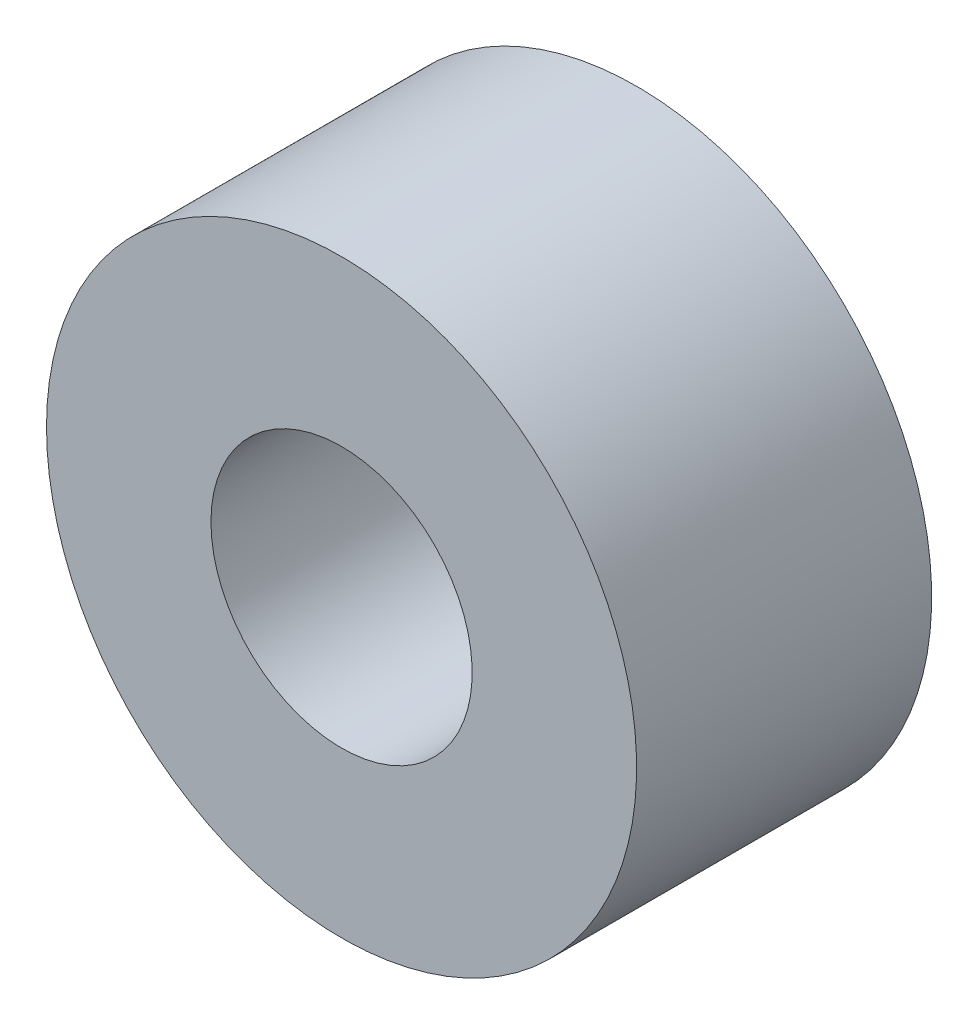
ISO-10303-21;
HEADER;
FILE_DESCRIPTION(('STEP AP214'),'2;1');
FILE_NAME('part.step','',(''),(''),'','','');
FILE_SCHEMA(('AUTOMOTIVE_DESIGN { 1 0 10303 214 1 1 1 1 }'));
ENDSEC;
DATA;
#1=APPLICATION_CONTEXT('core data for automotive mechanical design processes');
#2=APPLICATION_PROTOCOL_DEFINITION('international standard','automotive_design',2000,#1);
#3=PRODUCT_CONTEXT('',#1,'mechanical');
#4=PRODUCT('Part','Part','',(#3));
#5=PRODUCT_RELATED_PRODUCT_CATEGORY('part','',(#4));
#6=PRODUCT_DEFINITION_FORMATION('','',#4);
#7=PRODUCT_DEFINITION_CONTEXT('part definition',#1,'design');
#8=PRODUCT_DEFINITION('design','',#6,#7);
#9=PRODUCT_DEFINITION_SHAPE('','',#8);
#10=(LENGTH_UNIT() NAMED_UNIT(*) SI_UNIT(.MILLI.,.METRE.));
#11=(NAMED_UNIT(*) PLANE_ANGLE_UNIT() SI_UNIT($,.RADIAN.));
#12=(NAMED_UNIT(*) SI_UNIT($,.STERADIAN.) SOLID_ANGLE_UNIT());
#13=UNCERTAINTY_MEASURE_WITH_UNIT(LENGTH_MEASURE(1.E-05),#10,'distance_accuracy_value','');
#14=(GEOMETRIC_REPRESENTATION_CONTEXT(3) GLOBAL_UNCERTAINTY_ASSIGNED_CONTEXT((#13)) GLOBAL_UNIT_ASSIGNED_CONTEXT((#10,
#11,#12)) REPRESENTATION_CONTEXT('',''));
#15=CARTESIAN_POINT('',(0.,0.,0.));
#16=DIRECTION('',(0.,0.,1.));
#17=DIRECTION('',(1.,0.,0.));
#18=AXIS2_PLACEMENT_3D('',#15,#16,#17);
#19=CARTESIAN_POINT('',(0.,0.,2.38125));
#20=DIRECTION('',(0.,0.,1.));
#21=DIRECTION('',(1.,0.,0.));
#22=AXIS2_PLACEMENT_3D('',#19,#20,#21);
#23=PLANE('',#22);
#24=CARTESIAN_POINT('',(0.,0.,2.38125));
#25=DIRECTION('',(0.,0.,1.));
#26=DIRECTION('',(1.,0.,0.));
#27=AXIS2_PLACEMENT_3D('',#24,#25,#26);
#28=CIRCLE('',#27,4.7625);
#29=CARTESIAN_POINT('',(-4.7625,0.,2.38125));
#30=VERTEX_POINT('',#29);
#31=EDGE_CURVE('E10',#30,#30,#28,.T.);
#32=ORIENTED_EDGE('',*,*,#31,.T.);
#33=EDGE_LOOP('',(#32));
#34=FACE_BOUND('',#33,.T.);
#35=CARTESIAN_POINT('',(0.,0.,2.38125));
#36=DIRECTION('',(0.,0.,1.));
#37=DIRECTION('',(1.,0.,0.));
#38=AXIS2_PLACEMENT_3D('',#35,#36,#37);
#39=CIRCLE('',#38,2.1082);
#40=CARTESIAN_POINT('',(-2.1082,0.,2.38125));
#41=VERTEX_POINT('',#40);
#42=EDGE_CURVE('E41',#41,#41,#39,.T.);
#43=ORIENTED_EDGE('',*,*,#42,.F.);
#44=EDGE_LOOP('',(#43));
#45=FACE_BOUND('',#44,.T.);
#46=ADVANCED_FACE('F30',(#34,#45),#23,.T.);
#47=CARTESIAN_POINT('',(0.,0.,-2.38125));
#48=DIRECTION('',(0.,0.,1.));
#49=DIRECTION('',(1.,0.,0.));
#50=AXIS2_PLACEMENT_3D('',#47,#48,#49);
#51=PLANE('',#50);
#52=CARTESIAN_POINT('',(0.,0.,-2.38125));
#53=DIRECTION('',(0.,0.,1.));
#54=DIRECTION('',(1.,0.,0.));
#55=AXIS2_PLACEMENT_3D('',#52,#53,#54);
#56=CIRCLE('',#55,4.7625);
#57=CARTESIAN_POINT('',(-4.7625,0.,-2.38125));
#58=VERTEX_POINT('',#57);
#59=EDGE_CURVE('E34',#58,#58,#56,.T.);
#60=ORIENTED_EDGE('',*,*,#59,.F.);
#61=EDGE_LOOP('',(#60));
#62=FACE_BOUND('',#61,.T.);
#63=CARTESIAN_POINT('',(0.,0.,-2.38125));
#64=DIRECTION('',(0.,0.,1.));
#65=DIRECTION('',(1.,0.,0.));
#66=AXIS2_PLACEMENT_3D('',#63,#64,#65);
#67=CIRCLE('',#66,2.1082);
#68=CARTESIAN_POINT('',(-2.1082,0.,-2.38125));
#69=VERTEX_POINT('',#68);
#70=EDGE_CURVE('E43',#69,#69,#67,.T.);
#71=ORIENTED_EDGE('',*,*,#70,.T.);
#72=EDGE_LOOP('',(#71));
#73=FACE_BOUND('',#72,.T.);
#74=ADVANCED_FACE('F53',(#62,#73),#51,.F.);
#75=CARTESIAN_POINT('',(0.,0.,2.38125));
#76=DIRECTION('',(0.,0.,-1.));
#77=DIRECTION('',(-1.,0.,0.));
#78=AXIS2_PLACEMENT_3D('',#75,#76,#77);
#79=CYLINDRICAL_SURFACE('',#78,4.7625);
#80=CARTESIAN_POINT('',(-4.7625,0.,2.38125));
#81=CARTESIAN_POINT('',(-4.7625,0.,2.331640625));
#82=CARTESIAN_POINT('',(-4.7625,0.,2.28203125));
#83=CARTESIAN_POINT('',(-4.7625,0.,2.1828125));
#84=CARTESIAN_POINT('',(-4.7625,0.,2.133203125));
#85=CARTESIAN_POINT('',(-4.7625,0.,2.033984375));
#86=CARTESIAN_POINT('',(-4.7625,0.,1.984375));
#87=CARTESIAN_POINT('',(-4.7625,0.,1.88515625));
#88=CARTESIAN_POINT('',(-4.7625,0.,1.835546875));
#89=CARTESIAN_POINT('',(-4.7625,0.,1.736328125));
#90=CARTESIAN_POINT('',(-4.7625,0.,1.68671875));
#91=CARTESIAN_POINT('',(-4.7625,0.,1.5875));
#92=CARTESIAN_POINT('',(-4.7625,0.,1.537890625));
#93=CARTESIAN_POINT('',(-4.7625,0.,1.438671875));
#94=CARTESIAN_POINT('',(-4.7625,0.,1.3890625));
#95=CARTESIAN_POINT('',(-4.7625,0.,1.28984375));
#96=CARTESIAN_POINT('',(-4.7625,0.,1.240234375));
#97=CARTESIAN_POINT('',(-4.7625,0.,1.141015625));
#98=CARTESIAN_POINT('',(-4.7625,0.,1.09140625));
#99=CARTESIAN_POINT('',(-4.7625,0.,0.9921875));
#100=CARTESIAN_POINT('',(-4.7625,0.,0.942578125));
#101=CARTESIAN_POINT('',(-4.7625,0.,0.843359375));
#102=CARTESIAN_POINT('',(-4.7625,0.,0.79375));
#103=CARTESIAN_POINT('',(-4.7625,0.,0.69453125));
#104=CARTESIAN_POINT('',(-4.7625,0.,0.644921875));
#105=CARTESIAN_POINT('',(-4.7625,0.,0.545703125));
#106=CARTESIAN_POINT('',(-4.7625,0.,0.49609375));
#107=CARTESIAN_POINT('',(-4.7625,0.,0.396875));
#108=CARTESIAN_POINT('',(-4.7625,0.,0.347265625));
#109=CARTESIAN_POINT('',(-4.7625,0.,0.248046875));
#110=CARTESIAN_POINT('',(-4.7625,0.,0.1984375));
#111=CARTESIAN_POINT('',(-4.7625,0.,0.09921875));
#112=CARTESIAN_POINT('',(-4.7625,0.,0.049609375));
#113=CARTESIAN_POINT('',(-4.7625,0.,-0.049609375));
#114=CARTESIAN_POINT('',(-4.7625,0.,-0.09921875));
#115=CARTESIAN_POINT('',(-4.7625,0.,-0.1984375));
#116=CARTESIAN_POINT('',(-4.7625,0.,-0.248046875));
#117=CARTESIAN_POINT('',(-4.7625,0.,-0.347265625));
#118=CARTESIAN_POINT('',(-4.7625,0.,-0.396875));
#119=CARTESIAN_POINT('',(-4.7625,0.,-0.49609375));
#120=CARTESIAN_POINT('',(-4.7625,0.,-0.545703125));
#121=CARTESIAN_POINT('',(-4.7625,0.,-0.644921875));
#122=CARTESIAN_POINT('',(-4.7625,0.,-0.69453125));
#123=CARTESIAN_POINT('',(-4.7625,0.,-0.79375));
#124=CARTESIAN_POINT('',(-4.7625,0.,-0.843359375));
#125=CARTESIAN_POINT('',(-4.7625,0.,-0.942578125));
#126=CARTESIAN_POINT('',(-4.7625,0.,-0.9921875));
#127=CARTESIAN_POINT('',(-4.7625,0.,-1.09140625));
#128=CARTESIAN_POINT('',(-4.7625,0.,-1.141015625));
#129=CARTESIAN_POINT('',(-4.7625,0.,-1.240234375));
#130=CARTESIAN_POINT('',(-4.7625,0.,-1.28984375));
#131=CARTESIAN_POINT('',(-4.7625,0.,-1.3890625));
#132=CARTESIAN_POINT('',(-4.7625,0.,-1.438671875));
#133=CARTESIAN_POINT('',(-4.7625,0.,-1.537890625));
#134=CARTESIAN_POINT('',(-4.7625,0.,-1.5875));
#135=CARTESIAN_POINT('',(-4.7625,0.,-1.68671875));
#136=CARTESIAN_POINT('',(-4.7625,0.,-1.736328125));
#137=CARTESIAN_POINT('',(-4.7625,0.,-1.835546875));
#138=CARTESIAN_POINT('',(-4.7625,0.,-1.88515625));
#139=CARTESIAN_POINT('',(-4.7625,0.,-1.984375));
#140=CARTESIAN_POINT('',(-4.7625,0.,-2.033984375));
#141=CARTESIAN_POINT('',(-4.7625,0.,-2.133203125));
#142=CARTESIAN_POINT('',(-4.7625,0.,-2.1828125));
#143=CARTESIAN_POINT('',(-4.7625,0.,-2.28203125));
#144=CARTESIAN_POINT('',(-4.7625,0.,-2.331640625));
#145=CARTESIAN_POINT('',(-4.7625,0.,-2.38125));
#146=B_SPLINE_CURVE_WITH_KNOTS('',3,(#80,#81,#82,#83,#84,#85,#86,#87,#88,#89,#90,#91,#92,#93,
#94,#95,#96,#97,#98,#99,#100,#101,#102,#103,#104,#105,#106,#107,#108,#109,#110,#111,#112,#113,
#114,#115,#116,#117,#118,#119,#120,#121,#122,#123,#124,#125,#126,#127,#128,#129,#130,#131,#132,
#133,#134,#135,#136,#137,#138,#139,#140,#141,#142,#143,#144,#145),.UNSPECIFIED.,.F.,.F.,(4,2,2,
2,2,2,2,2,2,2,2,2,2,2,2,2,2,2,2,2,2,2,2,2,2,2,2,2,2,2,2,2,4),(0.,0.148828125,0.29765625,
0.446484375,0.5953125,0.744140625,0.89296875,1.041796875,1.190625,1.339453125,1.48828125,
1.637109375,1.7859375,1.934765625,2.08359375,2.232421875,2.38125,2.530078125,2.67890625,
2.827734375,2.9765625,3.125390625,3.27421875,3.423046875,3.571875,3.720703125,3.86953125,
4.018359375,4.1671875,4.316015625,4.46484375,4.613671875,4.7625),.UNSPECIFIED.);
#147=EDGE_CURVE('BSEAM32',#30,#58,#146,.T.);
#148=ORIENTED_EDGE('',*,*,#31,.F.);
#149=ORIENTED_EDGE('',*,*,#59,.T.);
#150=ORIENTED_EDGE('',*,*,#147,.T.);
#151=ORIENTED_EDGE('',*,*,#147,.F.);
#152=EDGE_LOOP('',(#148,#150,#149,#151));
#153=FACE_BOUND('',#152,.T.);
#154=ADVANCED_FACE('F32',(#153),#79,.T.);
#155=CARTESIAN_POINT('',(0.,0.,2.38125));
#156=DIRECTION('',(0.,0.,-1.));
#157=DIRECTION('',(-1.,0.,0.));
#158=AXIS2_PLACEMENT_3D('',#155,#156,#157);
#159=CYLINDRICAL_SURFACE('',#158,2.1082);
#160=CARTESIAN_POINT('',(-2.1082,0.,2.38125));
#161=CARTESIAN_POINT('',(-2.1082,0.,2.331640625));
#162=CARTESIAN_POINT('',(-2.1082,0.,2.28203125));
#163=CARTESIAN_POINT('',(-2.1082,0.,2.1828125));
#164=CARTESIAN_POINT('',(-2.1082,0.,2.133203125));
#165=CARTESIAN_POINT('',(-2.1082,0.,2.033984375));
#166=CARTESIAN_POINT('',(-2.1082,0.,1.984375));
#167=CARTESIAN_POINT('',(-2.1082,0.,1.88515625));
#168=CARTESIAN_POINT('',(-2.1082,0.,1.835546875));
#169=CARTESIAN_POINT('',(-2.1082,0.,1.736328125));
#170=CARTESIAN_POINT('',(-2.1082,0.,1.68671875));
#171=CARTESIAN_POINT('',(-2.1082,0.,1.5875));
#172=CARTESIAN_POINT('',(-2.1082,0.,1.537890625));
#173=CARTESIAN_POINT('',(-2.1082,0.,1.438671875));
#174=CARTESIAN_POINT('',(-2.1082,0.,1.3890625));
#175=CARTESIAN_POINT('',(-2.1082,0.,1.28984375));
#176=CARTESIAN_POINT('',(-2.1082,0.,1.240234375));
#177=CARTESIAN_POINT('',(-2.1082,0.,1.141015625));
#178=CARTESIAN_POINT('',(-2.1082,0.,1.09140625));
#179=CARTESIAN_POINT('',(-2.1082,0.,0.9921875));
#180=CARTESIAN_POINT('',(-2.1082,0.,0.942578125));
#181=CARTESIAN_POINT('',(-2.1082,0.,0.843359375));
#182=CARTESIAN_POINT('',(-2.1082,0.,0.79375));
#183=CARTESIAN_POINT('',(-2.1082,0.,0.69453125));
#184=CARTESIAN_POINT('',(-2.1082,0.,0.644921875));
#185=CARTESIAN_POINT('',(-2.1082,0.,0.545703125));
#186=CARTESIAN_POINT('',(-2.1082,0.,0.49609375));
#187=CARTESIAN_POINT('',(-2.1082,0.,0.396875));
#188=CARTESIAN_POINT('',(-2.1082,0.,0.347265625));
#189=CARTESIAN_POINT('',(-2.1082,0.,0.248046875));
#190=CARTESIAN_POINT('',(-2.1082,0.,0.1984375));
#191=CARTESIAN_POINT('',(-2.1082,0.,0.09921875));
#192=CARTESIAN_POINT('',(-2.1082,0.,0.049609375));
#193=CARTESIAN_POINT('',(-2.1082,0.,-0.049609375));
#194=CARTESIAN_POINT('',(-2.1082,0.,-0.09921875));
#195=CARTESIAN_POINT('',(-2.1082,0.,-0.1984375));
#196=CARTESIAN_POINT('',(-2.1082,0.,-0.248046875));
#197=CARTESIAN_POINT('',(-2.1082,0.,-0.347265625));
#198=CARTESIAN_POINT('',(-2.1082,0.,-0.396875));
#199=CARTESIAN_POINT('',(-2.1082,0.,-0.49609375));
#200=CARTESIAN_POINT('',(-2.1082,0.,-0.545703125));
#201=CARTESIAN_POINT('',(-2.1082,0.,-0.644921875));
#202=CARTESIAN_POINT('',(-2.1082,0.,-0.69453125));
#203=CARTESIAN_POINT('',(-2.1082,0.,-0.79375));
#204=CARTESIAN_POINT('',(-2.1082,0.,-0.843359375));
#205=CARTESIAN_POINT('',(-2.1082,0.,-0.942578125));
#206=CARTESIAN_POINT('',(-2.1082,0.,-0.9921875));
#207=CARTESIAN_POINT('',(-2.1082,0.,-1.09140625));
#208=CARTESIAN_POINT('',(-2.1082,0.,-1.141015625));
#209=CARTESIAN_POINT('',(-2.1082,0.,-1.240234375));
#210=CARTESIAN_POINT('',(-2.1082,0.,-1.28984375));
#211=CARTESIAN_POINT('',(-2.1082,0.,-1.3890625));
#212=CARTESIAN_POINT('',(-2.1082,0.,-1.438671875));
#213=CARTESIAN_POINT('',(-2.1082,0.,-1.537890625));
#214=CARTESIAN_POINT('',(-2.1082,0.,-1.5875));
#215=CARTESIAN_POINT('',(-2.1082,0.,-1.68671875));
#216=CARTESIAN_POINT('',(-2.1082,0.,-1.736328125));
#217=CARTESIAN_POINT('',(-2.1082,0.,-1.835546875));
#218=CARTESIAN_POINT('',(-2.1082,0.,-1.88515625));
#219=CARTESIAN_POINT('',(-2.1082,0.,-1.984375));
#220=CARTESIAN_POINT('',(-2.1082,0.,-2.033984375));
#221=CARTESIAN_POINT('',(-2.1082,0.,-2.133203125));
#222=CARTESIAN_POINT('',(-2.1082,0.,-2.1828125));
#223=CARTESIAN_POINT('',(-2.1082,0.,-2.28203125));
#224=CARTESIAN_POINT('',(-2.1082,0.,-2.331640625));
#225=CARTESIAN_POINT('',(-2.1082,0.,-2.38125));
#226=B_SPLINE_CURVE_WITH_KNOTS('',3,(#160,#161,#162,#163,#164,#165,#166,#167,#168,#169,#170,
#171,#172,#173,#174,#175,#176,#177,#178,#179,#180,#181,#182,#183,#184,#185,#186,#187,#188,#189,
#190,#191,#192,#193,#194,#195,#196,#197,#198,#199,#200,#201,#202,#203,#204,#205,#206,#207,#208,
#209,#210,#211,#212,#213,#214,#215,#216,#217,#218,#219,#220,#221,#222,#223,#224,#225),
.UNSPECIFIED.,.F.,.F.,(4,2,2,2,2,2,2,2,2,2,2,2,2,2,2,2,2,2,2,2,2,2,2,2,2,2,2,2,2,2,2,2,4),(0.,
0.148828125,0.29765625,0.446484375,0.5953125,0.744140625,0.89296875,1.041796875,1.190625,
1.339453125,1.48828125,1.637109375,1.7859375,1.934765625,2.08359375,2.232421875,2.38125,
2.530078125,2.67890625,2.827734375,2.9765625,3.125390625,3.27421875,3.423046875,3.571875,
3.720703125,3.86953125,4.018359375,4.1671875,4.316015625,4.46484375,4.613671875,4.7625),.UNSPECIFIED.);
#227=EDGE_CURVE('BSEAM49',#41,#69,#226,.T.);
#228=ORIENTED_EDGE('',*,*,#42,.T.);
#229=ORIENTED_EDGE('',*,*,#70,.F.);
#230=ORIENTED_EDGE('',*,*,#227,.T.);
#231=ORIENTED_EDGE('',*,*,#227,.F.);
#232=EDGE_LOOP('',(#228,#230,#229,#231));
#233=FACE_BOUND('',#232,.T.);
#234=ADVANCED_FACE('F49',(#233),#159,.F.);
#235=CLOSED_SHELL('',(#46,#74,#154,#234));
#236=MANIFOLD_SOLID_BREP('B2',#235);
#237=ADVANCED_BREP_SHAPE_REPRESENTATION('',(#18,#236),#14);
#238=SHAPE_DEFINITION_REPRESENTATION(#9,#237);
ENDSEC;
END-ISO-10303-21;
